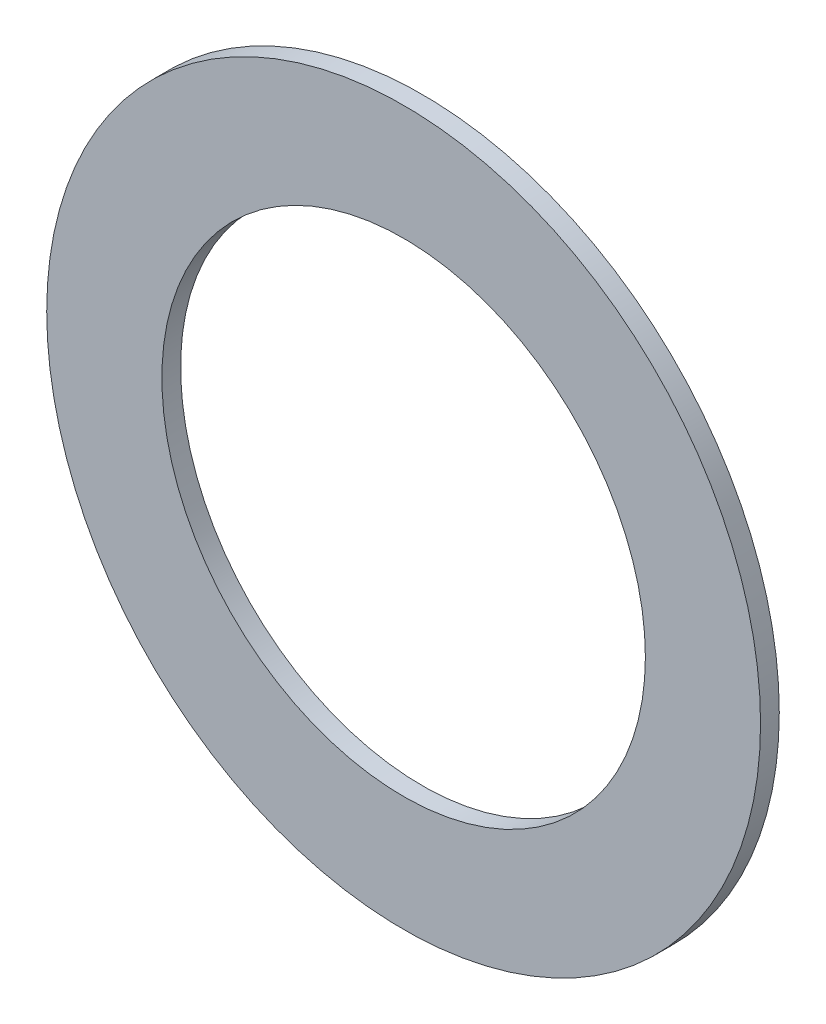
ISO-10303-21;
HEADER;
FILE_DESCRIPTION(('STEP AP214'),'2;1');
FILE_NAME('part.step','',(''),(''),'','','');
FILE_SCHEMA(('AUTOMOTIVE_DESIGN { 1 0 10303 214 1 1 1 1 }'));
ENDSEC;
DATA;
#1=APPLICATION_CONTEXT('core data for automotive mechanical design processes');
#2=APPLICATION_PROTOCOL_DEFINITION('international standard','automotive_design',2000,#1);
#3=PRODUCT_CONTEXT('',#1,'mechanical');
#4=PRODUCT('Part','Part','',(#3));
#5=PRODUCT_RELATED_PRODUCT_CATEGORY('part','',(#4));
#6=PRODUCT_DEFINITION_FORMATION('','',#4);
#7=PRODUCT_DEFINITION_CONTEXT('part definition',#1,'design');
#8=PRODUCT_DEFINITION('design','',#6,#7);
#9=PRODUCT_DEFINITION_SHAPE('','',#8);
#10=(LENGTH_UNIT() NAMED_UNIT(*) SI_UNIT(.MILLI.,.METRE.));
#11=(NAMED_UNIT(*) PLANE_ANGLE_UNIT() SI_UNIT($,.RADIAN.));
#12=(NAMED_UNIT(*) SI_UNIT($,.STERADIAN.) SOLID_ANGLE_UNIT());
#13=UNCERTAINTY_MEASURE_WITH_UNIT(LENGTH_MEASURE(1.E-05),#10,'distance_accuracy_value','');
#14=(GEOMETRIC_REPRESENTATION_CONTEXT(3) GLOBAL_UNCERTAINTY_ASSIGNED_CONTEXT((#13)) GLOBAL_UNIT_ASSIGNED_CONTEXT((#10,
#11,#12)) REPRESENTATION_CONTEXT('',''));
#15=CARTESIAN_POINT('',(0.,0.,0.));
#16=DIRECTION('',(0.,0.,1.));
#17=DIRECTION('',(1.,0.,0.));
#18=AXIS2_PLACEMENT_3D('',#15,#16,#17);
#19=CARTESIAN_POINT('',(0.,0.,4.));
#20=DIRECTION('',(0.,0.,-1.));
#21=DIRECTION('',(-1.,0.,0.));
#22=AXIS2_PLACEMENT_3D('',#19,#20,#21);
#23=CYLINDRICAL_SURFACE('',#22,51.6125);
#24=CARTESIAN_POINT('',(0.,0.,4.));
#25=DIRECTION('',(0.,0.,1.));
#26=DIRECTION('',(1.,0.,0.));
#27=AXIS2_PLACEMENT_3D('',#24,#25,#26);
#28=CIRCLE('',#27,51.6125);
#29=CARTESIAN_POINT('',(51.6125,0.,4.));
#30=VERTEX_POINT('',#29);
#31=EDGE_CURVE('E38',#30,#30,#28,.T.);
#32=ORIENTED_EDGE('',*,*,#31,.T.);
#33=EDGE_LOOP('',(#32));
#34=FACE_BOUND('',#33,.T.);
#35=CARTESIAN_POINT('',(0.,0.,0.));
#36=DIRECTION('',(0.,0.,1.));
#37=DIRECTION('',(1.,0.,0.));
#38=AXIS2_PLACEMENT_3D('',#35,#36,#37);
#39=CIRCLE('',#38,51.6125);
#40=CARTESIAN_POINT('',(51.6125,0.,0.));
#41=VERTEX_POINT('',#40);
#42=EDGE_CURVE('E44',#41,#41,#39,.T.);
#43=ORIENTED_EDGE('',*,*,#42,.F.);
#44=EDGE_LOOP('',(#43));
#45=FACE_BOUND('',#44,.T.);
#46=ADVANCED_FACE('F31',(#34,#45),#23,.F.);
#47=CARTESIAN_POINT('',(0.,0.,4.));
#48=DIRECTION('',(0.,0.,-1.));
#49=DIRECTION('',(-1.,0.,0.));
#50=AXIS2_PLACEMENT_3D('',#47,#48,#49);
#51=CYLINDRICAL_SURFACE('',#50,76.2);
#52=CARTESIAN_POINT('',(0.,0.,4.));
#53=DIRECTION('',(0.,0.,1.));
#54=DIRECTION('',(1.,0.,0.));
#55=AXIS2_PLACEMENT_3D('',#52,#53,#54);
#56=CIRCLE('',#55,76.2);
#57=CARTESIAN_POINT('',(76.2,0.,4.));
#58=VERTEX_POINT('',#57);
#59=EDGE_CURVE('E10',#58,#58,#56,.T.);
#60=ORIENTED_EDGE('',*,*,#59,.F.);
#61=EDGE_LOOP('',(#60));
#62=FACE_BOUND('',#61,.T.);
#63=CARTESIAN_POINT('',(0.,0.,0.));
#64=DIRECTION('',(0.,0.,1.));
#65=DIRECTION('',(1.,0.,0.));
#66=AXIS2_PLACEMENT_3D('',#63,#64,#65);
#67=CIRCLE('',#66,76.2);
#68=CARTESIAN_POINT('',(76.2,0.,0.));
#69=VERTEX_POINT('',#68);
#70=EDGE_CURVE('E34',#69,#69,#67,.T.);
#71=ORIENTED_EDGE('',*,*,#70,.T.);
#72=EDGE_LOOP('',(#71));
#73=FACE_BOUND('',#72,.T.);
#74=ADVANCED_FACE('F51',(#62,#73),#51,.T.);
#75=CARTESIAN_POINT('',(0.,0.,4.));
#76=DIRECTION('',(0.,0.,1.));
#77=DIRECTION('',(1.,0.,0.));
#78=AXIS2_PLACEMENT_3D('',#75,#76,#77);
#79=PLANE('',#78);
#80=ORIENTED_EDGE('',*,*,#31,.F.);
#81=EDGE_LOOP('',(#80));
#82=FACE_BOUND('',#81,.T.);
#83=ORIENTED_EDGE('',*,*,#59,.T.);
#84=EDGE_LOOP('',(#83));
#85=FACE_BOUND('',#84,.T.);
#86=ADVANCED_FACE('F55',(#82,#85),#79,.T.);
#87=CARTESIAN_POINT('',(0.,0.,0.));
#88=DIRECTION('',(0.,0.,1.));
#89=DIRECTION('',(1.,0.,0.));
#90=AXIS2_PLACEMENT_3D('',#87,#88,#89);
#91=PLANE('',#90);
#92=ORIENTED_EDGE('',*,*,#42,.T.);
#93=EDGE_LOOP('',(#92));
#94=FACE_BOUND('',#93,.T.);
#95=ORIENTED_EDGE('',*,*,#70,.F.);
#96=EDGE_LOOP('',(#95));
#97=FACE_BOUND('',#96,.T.);
#98=ADVANCED_FACE('F53',(#94,#97),#91,.F.);
#99=CLOSED_SHELL('',(#46,#74,#86,#98));
#100=MANIFOLD_SOLID_BREP('B2',#99);
#101=ADVANCED_BREP_SHAPE_REPRESENTATION('',(#18,#100),#14);
#102=SHAPE_DEFINITION_REPRESENTATION(#9,#101);
ENDSEC;
END-ISO-10303-21;
